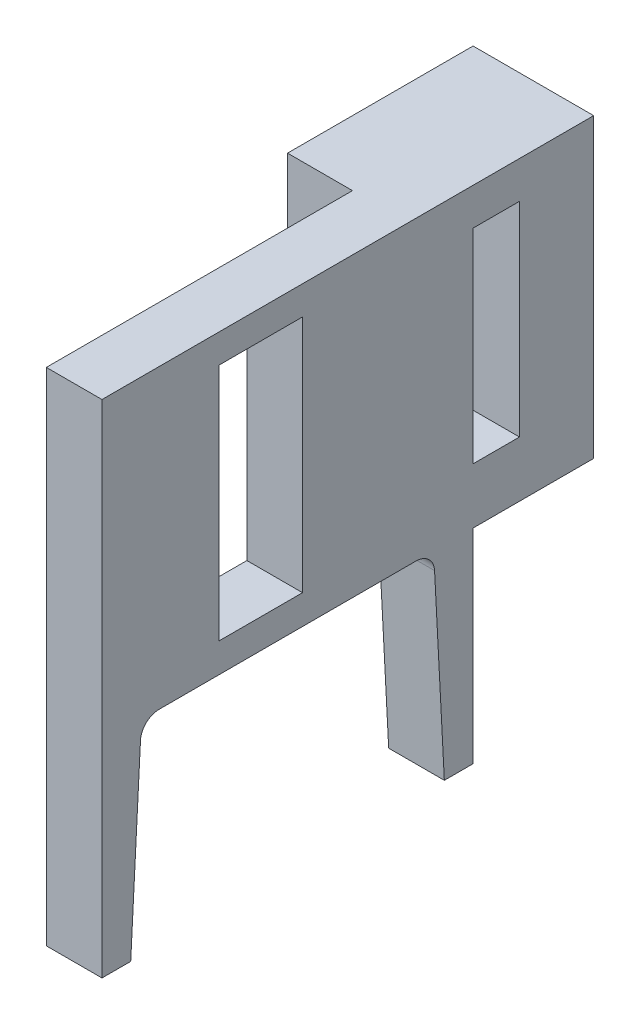
ISO-10303-21;
HEADER;
FILE_DESCRIPTION(('STEP AP214'),'2;1');
FILE_NAME('part.step','',(''),(''),'','','');
FILE_SCHEMA(('AUTOMOTIVE_DESIGN { 1 0 10303 214 1 1 1 1 }'));
ENDSEC;
DATA;
#1=APPLICATION_CONTEXT('core data for automotive mechanical design processes');
#2=APPLICATION_PROTOCOL_DEFINITION('international standard','automotive_design',2000,#1);
#3=PRODUCT_CONTEXT('',#1,'mechanical');
#4=PRODUCT('Part','Part','',(#3));
#5=PRODUCT_RELATED_PRODUCT_CATEGORY('part','',(#4));
#6=PRODUCT_DEFINITION_FORMATION('','',#4);
#7=PRODUCT_DEFINITION_CONTEXT('part definition',#1,'design');
#8=PRODUCT_DEFINITION('design','',#6,#7);
#9=PRODUCT_DEFINITION_SHAPE('','',#8);
#10=(LENGTH_UNIT() NAMED_UNIT(*) SI_UNIT(.MILLI.,.METRE.));
#11=(NAMED_UNIT(*) PLANE_ANGLE_UNIT() SI_UNIT($,.RADIAN.));
#12=(NAMED_UNIT(*) SI_UNIT($,.STERADIAN.) SOLID_ANGLE_UNIT());
#13=UNCERTAINTY_MEASURE_WITH_UNIT(LENGTH_MEASURE(1.E-05),#10,'distance_accuracy_value','');
#14=(GEOMETRIC_REPRESENTATION_CONTEXT(3) GLOBAL_UNCERTAINTY_ASSIGNED_CONTEXT((#13)) GLOBAL_UNIT_ASSIGNED_CONTEXT((#10,
#11,#12)) REPRESENTATION_CONTEXT('',''));
#15=CARTESIAN_POINT('',(0.,0.,0.));
#16=DIRECTION('',(0.,0.,1.));
#17=DIRECTION('',(1.,0.,0.));
#18=AXIS2_PLACEMENT_3D('',#15,#16,#17);
#19=CARTESIAN_POINT('',(13.,-16.,26.5));
#20=DIRECTION('',(0.,1.,0.));
#21=DIRECTION('',(0.,0.,-1.));
#22=AXIS2_PLACEMENT_3D('',#19,#20,#21);
#23=PLANE('',#22);
#24=DIRECTION('',(-1.,0.,0.));
#25=VECTOR('',#24,1.);
#26=CARTESIAN_POINT('',(13.,-16.,26.5));
#27=LINE('',#26,#25);
#28=CARTESIAN_POINT('',(13.,-16.,26.5));
#29=VERTEX_POINT('',#28);
#30=CARTESIAN_POINT('',(7.00000000000001,-16.,26.5));
#31=VERTEX_POINT('',#30);
#32=EDGE_CURVE('E441',#29,#31,#27,.T.);
#33=ORIENTED_EDGE('',*,*,#32,.F.);
#34=DIRECTION('',(0.,0.,1.));
#35=VECTOR('',#34,1.);
#36=CARTESIAN_POINT('',(13.,-16.,26.5));
#37=LINE('',#36,#35);
#38=CARTESIAN_POINT('',(13.,-16.,39.5));
#39=VERTEX_POINT('',#38);
#40=EDGE_CURVE('E438',#29,#39,#37,.T.);
#41=ORIENTED_EDGE('',*,*,#40,.T.);
#42=DIRECTION('',(-1.,0.,0.));
#43=VECTOR('',#42,1.);
#44=CARTESIAN_POINT('',(13.,-16.,39.5));
#45=LINE('',#44,#43);
#46=CARTESIAN_POINT('',(7.00000000000001,-16.,39.5));
#47=VERTEX_POINT('',#46);
#48=EDGE_CURVE('E403',#39,#47,#45,.T.);
#49=ORIENTED_EDGE('',*,*,#48,.T.);
#50=DIRECTION('',(0.,0.,-1.));
#51=VECTOR('',#50,1.);
#52=CARTESIAN_POINT('',(7.00000000000001,-16.,46.5));
#53=LINE('',#52,#51);
#54=EDGE_CURVE('E357',#47,#31,#53,.T.);
#55=ORIENTED_EDGE('',*,*,#54,.T.);
#56=EDGE_LOOP('',(#33,#41,#49,#55));
#57=FACE_BOUND('',#56,.T.);
#58=ADVANCED_FACE('F32',(#57),#23,.F.);
#59=CARTESIAN_POINT('',(0.,0.,53.));
#60=DIRECTION('',(1.,0.,0.));
#61=DIRECTION('',(0.,0.,1.));
#62=AXIS2_PLACEMENT_3D('',#59,#60,#61);
#63=PLANE('',#62);
#64=DIRECTION('',(0.,0.,-1.));
#65=VECTOR('',#64,1.);
#66=CARTESIAN_POINT('',(0.,-10.,39.5));
#67=LINE('',#66,#65);
#68=CARTESIAN_POINT('',(0.,-10.,39.5));
#69=VERTEX_POINT('',#68);
#70=CARTESIAN_POINT('',(0.,-10.,34.5));
#71=VERTEX_POINT('',#70);
#72=EDGE_CURVE('E241',#69,#71,#67,.T.);
#73=ORIENTED_EDGE('',*,*,#72,.T.);
#74=DIRECTION('',(0.,1.,0.));
#75=VECTOR('',#74,1.);
#76=CARTESIAN_POINT('',(0.,12.,34.5));
#77=LINE('',#76,#75);
#78=CARTESIAN_POINT('',(0.,12.,34.5));
#79=VERTEX_POINT('',#78);
#80=EDGE_CURVE('E258',#71,#79,#77,.T.);
#81=ORIENTED_EDGE('',*,*,#80,.T.);
#82=DIRECTION('',(0.,0.,1.));
#83=VECTOR('',#82,1.);
#84=CARTESIAN_POINT('',(0.,12.,39.5));
#85=LINE('',#84,#83);
#86=CARTESIAN_POINT('',(0.,12.,39.5));
#87=VERTEX_POINT('',#86);
#88=EDGE_CURVE('E255',#79,#87,#85,.T.);
#89=ORIENTED_EDGE('',*,*,#88,.T.);
#90=DIRECTION('',(0.,-1.,0.));
#91=VECTOR('',#90,1.);
#92=CARTESIAN_POINT('',(0.,12.,39.5));
#93=LINE('',#92,#91);
#94=EDGE_CURVE('E263',#87,#69,#93,.T.);
#95=ORIENTED_EDGE('',*,*,#94,.T.);
#96=EDGE_LOOP('',(#73,#81,#89,#95));
#97=FACE_BOUND('',#96,.T.);
#98=DIRECTION('',(0.,0.,1.));
#99=VECTOR('',#98,1.);
#100=CARTESIAN_POINT('',(0.,-13.,46.5));
#101=LINE('',#100,#99);
#102=CARTESIAN_POINT('',(0.,-13.,26.5));
#103=VERTEX_POINT('',#102);
#104=CARTESIAN_POINT('',(0.,-13.,46.5));
#105=VERTEX_POINT('',#104);
#106=EDGE_CURVE('E368',#103,#105,#101,.T.);
#107=ORIENTED_EDGE('',*,*,#106,.T.);
#108=DIRECTION('',(0.,1.,0.));
#109=VECTOR('',#108,1.);
#110=CARTESIAN_POINT('',(0.,-16.,46.5));
#111=LINE('',#110,#109);
#112=CARTESIAN_POINT('',(0.,16.,46.5));
#113=VERTEX_POINT('',#112);
#114=EDGE_CURVE('E381',#105,#113,#111,.T.);
#115=ORIENTED_EDGE('',*,*,#114,.T.);
#116=DIRECTION('',(0.,0.,-1.));
#117=VECTOR('',#116,1.);
#118=CARTESIAN_POINT('',(0.,16.,26.5));
#119=LINE('',#118,#117);
#120=CARTESIAN_POINT('',(0.,16.,26.5));
#121=VERTEX_POINT('',#120);
#122=EDGE_CURVE('E428',#113,#121,#119,.T.);
#123=ORIENTED_EDGE('',*,*,#122,.T.);
#124=DIRECTION('',(0.,-1.,0.));
#125=VECTOR('',#124,1.);
#126=CARTESIAN_POINT('',(0.,16.,26.5));
#127=LINE('',#126,#125);
#128=EDGE_CURVE('E433',#121,#103,#127,.T.);
#129=ORIENTED_EDGE('',*,*,#128,.T.);
#130=EDGE_LOOP('',(#107,#115,#123,#129));
#131=FACE_BOUND('',#130,.T.);
#132=ADVANCED_FACE('F537',(#97,#131),#63,.F.);
#133=CARTESIAN_POINT('',(0.,0.,46.5));
#134=DIRECTION('',(0.,0.,-1.));
#135=DIRECTION('',(0.,-1.,0.));
#136=AXIS2_PLACEMENT_3D('',#133,#134,#135);
#137=PLANE('',#136);
#138=DIRECTION('',(1.,0.,0.));
#139=VECTOR('',#138,1.);
#140=CARTESIAN_POINT('',(7.00000000000001,-13.,46.5));
#141=LINE('',#140,#139);
#142=CARTESIAN_POINT('',(7.00000000000001,-13.,46.5));
#143=VERTEX_POINT('',#142);
#144=EDGE_CURVE('E371',#105,#143,#141,.T.);
#145=ORIENTED_EDGE('',*,*,#144,.T.);
#146=DIRECTION('',(0.,-1.,0.));
#147=VECTOR('',#146,1.);
#148=CARTESIAN_POINT('',(7.00000000000001,-16.,46.5));
#149=LINE('',#148,#147);
#150=CARTESIAN_POINT('',(7.00000000000001,16.,46.5));
#151=VERTEX_POINT('',#150);
#152=EDGE_CURVE('E378',#151,#143,#149,.T.);
#153=ORIENTED_EDGE('',*,*,#152,.F.);
#154=DIRECTION('',(1.,0.,0.));
#155=VECTOR('',#154,1.);
#156=CARTESIAN_POINT('',(7.00000000000001,16.,46.5));
#157=LINE('',#156,#155);
#158=EDGE_CURVE('E384',#113,#151,#157,.T.);
#159=ORIENTED_EDGE('',*,*,#158,.F.);
#160=ORIENTED_EDGE('',*,*,#114,.F.);
#161=EDGE_LOOP('',(#145,#153,#159,#160));
#162=FACE_BOUND('',#161,.T.);
#163=ADVANCED_FACE('F541',(#162),#137,.F.);
#164=CARTESIAN_POINT('',(7.,-16.,79.5));
#165=DIRECTION('',(1.,0.,0.));
#166=DIRECTION('',(0.,0.,1.));
#167=AXIS2_PLACEMENT_3D('',#164,#165,#166);
#168=PLANE('',#167);
#169=DIRECTION('',(0.,0.,1.));
#170=VECTOR('',#169,1.);
#171=CARTESIAN_POINT('',(7.,12.9015711105183,68.8814467422432));
#172=LINE('',#171,#170);
#173=CARTESIAN_POINT('',(7.,12.9015711105183,68.8814467422432));
#174=VERTEX_POINT('',#173);
#175=CARTESIAN_POINT('',(7.,12.9015711105183,77.5315578763154));
#176=VERTEX_POINT('',#175);
#177=EDGE_CURVE('E286',#174,#176,#172,.T.);
#178=ORIENTED_EDGE('',*,*,#177,.T.);
#179=DIRECTION('',(0.,-1.,0.));
#180=VECTOR('',#179,1.);
#181=CARTESIAN_POINT('',(7.,12.9015711105183,77.5315578763154));
#182=LINE('',#181,#180);
#183=CARTESIAN_POINT('',(7.,-13.1087867617339,77.5315578763154));
#184=VERTEX_POINT('',#183);
#185=EDGE_CURVE('E289',#176,#184,#182,.T.);
#186=ORIENTED_EDGE('',*,*,#185,.T.);
#187=DIRECTION('',(0.,0.,-1.));
#188=VECTOR('',#187,1.);
#189=CARTESIAN_POINT('',(7.,-13.1087867617339,68.8814467422432));
#190=LINE('',#189,#188);
#191=CARTESIAN_POINT('',(7.,-13.1087867617339,68.8814467422432));
#192=VERTEX_POINT('',#191);
#193=EDGE_CURVE('E277',#184,#192,#190,.T.);
#194=ORIENTED_EDGE('',*,*,#193,.T.);
#195=DIRECTION('',(0.,1.,0.));
#196=VECTOR('',#195,1.);
#197=CARTESIAN_POINT('',(7.,12.9015711105183,68.8814467422432));
#198=LINE('',#197,#196);
#199=EDGE_CURVE('E269',#192,#174,#198,.T.);
#200=ORIENTED_EDGE('',*,*,#199,.T.);
#201=EDGE_LOOP('',(#178,#186,#194,#200));
#202=FACE_BOUND('',#201,.T.);
#203=DIRECTION('',(0.,0.,-1.));
#204=VECTOR('',#203,1.);
#205=CARTESIAN_POINT('',(7.,-13.,56.6189440090903));
#206=LINE('',#205,#204);
#207=CARTESIAN_POINT('',(7.,-13.,56.6189440090903));
#208=VERTEX_POINT('',#207);
#209=CARTESIAN_POINT('',(7.,-13.,48.1070713689883));
#210=VERTEX_POINT('',#209);
#211=EDGE_CURVE('E315',#208,#210,#206,.T.);
#212=ORIENTED_EDGE('',*,*,#211,.T.);
#213=DIRECTION('',(0.,1.,0.));
#214=VECTOR('',#213,1.);
#215=CARTESIAN_POINT('',(7.,12.6981992928279,48.1070713689883));
#216=LINE('',#215,#214);
#217=CARTESIAN_POINT('',(7.,12.6981992928279,48.1070713689883));
#218=VERTEX_POINT('',#217);
#219=EDGE_CURVE('E318',#210,#218,#216,.T.);
#220=ORIENTED_EDGE('',*,*,#219,.T.);
#221=DIRECTION('',(0.,0.,1.));
#222=VECTOR('',#221,1.);
#223=CARTESIAN_POINT('',(7.,12.6981992928279,56.6189440090903));
#224=LINE('',#223,#222);
#225=CARTESIAN_POINT('',(7.,12.6981992928279,56.6189440090903));
#226=VERTEX_POINT('',#225);
#227=EDGE_CURVE('E306',#218,#226,#224,.T.);
#228=ORIENTED_EDGE('',*,*,#227,.T.);
#229=DIRECTION('',(0.,-1.,0.));
#230=VECTOR('',#229,1.);
#231=CARTESIAN_POINT('',(7.,12.6981992928279,56.6189440090903));
#232=LINE('',#231,#230);
#233=EDGE_CURVE('E296',#226,#208,#232,.T.);
#234=ORIENTED_EDGE('',*,*,#233,.T.);
#235=EDGE_LOOP('',(#212,#220,#228,#234));
#236=FACE_BOUND('',#235,.T.);
#237=DIRECTION('',(0.,0.,-1.));
#238=VECTOR('',#237,1.);
#239=CARTESIAN_POINT('',(7.,-12.8405154349878,66.8814467422432));
#240=LINE('',#239,#238);
#241=CARTESIAN_POINT('',(7.,-12.8405154349878,66.8814467422432));
#242=VERTEX_POINT('',#241);
#243=CARTESIAN_POINT('',(7.,-12.8405154349878,57.8814467422432));
#244=VERTEX_POINT('',#243);
#245=EDGE_CURVE('E347',#242,#244,#240,.T.);
#246=ORIENTED_EDGE('',*,*,#245,.T.);
#247=DIRECTION('',(0.,1.,0.));
#248=VECTOR('',#247,1.);
#249=CARTESIAN_POINT('',(7.,12.9015711105183,57.8814467422432));
#250=LINE('',#249,#248);
#251=CARTESIAN_POINT('',(7.,12.9015711105183,57.8814467422432));
#252=VERTEX_POINT('',#251);
#253=EDGE_CURVE('E350',#244,#252,#250,.T.);
#254=ORIENTED_EDGE('',*,*,#253,.T.);
#255=DIRECTION('',(0.,0.,1.));
#256=VECTOR('',#255,1.);
#257=CARTESIAN_POINT('',(7.,12.9015711105183,66.8814467422432));
#258=LINE('',#257,#256);
#259=CARTESIAN_POINT('',(7.,12.9015711105183,66.8814467422432));
#260=VERTEX_POINT('',#259);
#261=EDGE_CURVE('E335',#252,#260,#258,.T.);
#262=ORIENTED_EDGE('',*,*,#261,.T.);
#263=DIRECTION('',(0.,-1.,0.));
#264=VECTOR('',#263,1.);
#265=CARTESIAN_POINT('',(7.,12.9015711105183,66.8814467422432));
#266=LINE('',#265,#264);
#267=EDGE_CURVE('E325',#260,#242,#266,.T.);
#268=ORIENTED_EDGE('',*,*,#267,.T.);
#269=EDGE_LOOP('',(#246,#254,#262,#268));
#270=FACE_BOUND('',#269,.T.);
#271=ORIENTED_EDGE('',*,*,#152,.T.);
#272=DIRECTION('',(0.,0.,-1.));
#273=VECTOR('',#272,1.);
#274=CARTESIAN_POINT('',(7.00000000000001,-13.,46.5));
#275=LINE('',#274,#273);
#276=CARTESIAN_POINT('',(7.00000000000001,-13.,26.5));
#277=VERTEX_POINT('',#276);
#278=EDGE_CURVE('E363',#143,#277,#275,.T.);
#279=ORIENTED_EDGE('',*,*,#278,.T.);
#280=DIRECTION('',(0.,-1.,0.));
#281=VECTOR('',#280,1.);
#282=CARTESIAN_POINT('',(7.00000000000001,-13.,26.5));
#283=LINE('',#282,#281);
#284=EDGE_CURVE('E374',#277,#31,#283,.T.);
#285=ORIENTED_EDGE('',*,*,#284,.T.);
#286=ORIENTED_EDGE('',*,*,#54,.F.);
#287=DIRECTION('',(0.,1.,0.));
#288=VECTOR('',#287,1.);
#289=CARTESIAN_POINT('',(7.00000000000001,-38.,39.5));
#290=LINE('',#289,#288);
#291=CARTESIAN_POINT('',(7.00000000000001,-38.,39.5));
#292=VERTEX_POINT('',#291);
#293=EDGE_CURVE('E416',#292,#47,#290,.T.);
#294=ORIENTED_EDGE('',*,*,#293,.F.);
#295=DIRECTION('',(0.,0.,1.));
#296=VECTOR('',#295,1.);
#297=CARTESIAN_POINT('',(7.,-38.,79.5));
#298=LINE('',#297,#296);
#299=CARTESIAN_POINT('',(7.,-38.,42.5970288557731));
#300=VERTEX_POINT('',#299);
#301=EDGE_CURVE('E411',#292,#300,#298,.T.);
#302=ORIENTED_EDGE('',*,*,#301,.T.);
#303=DIRECTION('',(0.,-0.998629534754574,-0.0523359562429442));
#304=VECTOR('',#303,1.);
#305=CARTESIAN_POINT('',(7.,-14.1315537190907,43.8479211202921));
#306=LINE('',#305,#304);
#307=CARTESIAN_POINT('',(7.,-17.8953280875141,43.6506700639206));
#308=VERTEX_POINT('',#307);
#309=EDGE_CURVE('E398',#300,#308,#306,.F.);
#310=ORIENTED_EDGE('',*,*,#309,.T.);
#311=CARTESIAN_POINT('',(7.,-18.,45.6479291334297));
#312=DIRECTION('',(-1.,0.,0.));
#313=DIRECTION('',(0.,0.,1.));
#314=AXIS2_PLACEMENT_3D('',#311,#312,#313);
#315=CIRCLE('',#314,2.);
#316=CARTESIAN_POINT('',(7.00000000000001,-16.,45.6479291334297));
#317=VERTEX_POINT('',#316);
#318=EDGE_CURVE('E11',#308,#317,#315,.F.);
#319=ORIENTED_EDGE('',*,*,#318,.T.);
#320=DIRECTION('',(0.,0.,1.));
#321=VECTOR('',#320,1.);
#322=CARTESIAN_POINT('',(7.00000000000001,-16.,43.75));
#323=LINE('',#322,#321);
#324=CARTESIAN_POINT('',(7.00000000000001,-16.,73.3520708665702));
#325=VERTEX_POINT('',#324);
#326=EDGE_CURVE('E389',#317,#325,#323,.T.);
#327=ORIENTED_EDGE('',*,*,#326,.T.);
#328=CARTESIAN_POINT('',(7.,-18.,73.3520708665702));
#329=DIRECTION('',(-1.,0.,0.));
#330=DIRECTION('',(0.,0.,1.));
#331=AXIS2_PLACEMENT_3D('',#328,#329,#330);
#332=CIRCLE('',#331,2.);
#333=CARTESIAN_POINT('',(7.,-17.8953280875141,75.3493299360794));
#334=VERTEX_POINT('',#333);
#335=EDGE_CURVE('E464',#325,#334,#332,.F.);
#336=ORIENTED_EDGE('',*,*,#335,.T.);
#337=DIRECTION('',(0.,0.998629534754574,-0.0523359562429437));
#338=VECTOR('',#337,1.);
#339=CARTESIAN_POINT('',(7.,-16.2221229844438,75.2616409723424));
#340=LINE('',#339,#338);
#341=CARTESIAN_POINT('',(7.,-38.,76.4029711442269));
#342=VERTEX_POINT('',#341);
#343=EDGE_CURVE('E392',#334,#342,#340,.F.);
#344=ORIENTED_EDGE('',*,*,#343,.T.);
#345=CARTESIAN_POINT('',(7.,-38.,79.5));
#346=VERTEX_POINT('',#345);
#347=EDGE_CURVE('E410',#342,#346,#298,.T.);
#348=ORIENTED_EDGE('',*,*,#347,.T.);
#349=DIRECTION('',(0.,1.,0.));
#350=VECTOR('',#349,1.);
#351=CARTESIAN_POINT('',(7.,-16.,79.5));
#352=LINE('',#351,#350);
#353=CARTESIAN_POINT('',(7.,16.,79.5));
#354=VERTEX_POINT('',#353);
#355=EDGE_CURVE('E425',#346,#354,#352,.T.);
#356=ORIENTED_EDGE('',*,*,#355,.T.);
#357=DIRECTION('',(0.,0.,1.));
#358=VECTOR('',#357,1.);
#359=CARTESIAN_POINT('',(7.,16.,79.5));
#360=LINE('',#359,#358);
#361=EDGE_CURVE('E422',#151,#354,#360,.T.);
#362=ORIENTED_EDGE('',*,*,#361,.F.);
#363=EDGE_LOOP('',(#271,#279,#285,#286,#294,#302,#310,#319,#327,#336,#344,#348,#356,#362));
#364=FACE_BOUND('',#363,.T.);
#365=ADVANCED_FACE('F522',(#202,#236,#270,#364),#168,.F.);
#366=CARTESIAN_POINT('',(0.,-18.,45.6479291334297));
#367=DIRECTION('',(1.,0.,0.));
#368=DIRECTION('',(0.,0.,1.));
#369=AXIS2_PLACEMENT_3D('',#366,#367,#368);
#370=CYLINDRICAL_SURFACE('',#369,2.);
#371=DIRECTION('',(1.,0.,0.));
#372=VECTOR('',#371,1.);
#373=CARTESIAN_POINT('',(0.,-16.,45.6479291334297));
#374=LINE('',#373,#372);
#375=CARTESIAN_POINT('',(13.,-16.,45.6479291334297));
#376=VERTEX_POINT('',#375);
#377=EDGE_CURVE('E467',#376,#317,#374,.F.);
#378=ORIENTED_EDGE('',*,*,#377,.T.);
#379=ORIENTED_EDGE('',*,*,#318,.F.);
#380=DIRECTION('',(-1.,0.,0.));
#381=VECTOR('',#380,1.);
#382=CARTESIAN_POINT('',(13.,-17.8953280875141,43.6506700639206));
#383=LINE('',#382,#381);
#384=CARTESIAN_POINT('',(13.,-17.8953280875141,43.6506700639206));
#385=VERTEX_POINT('',#384);
#386=EDGE_CURVE('E469',#308,#385,#383,.F.);
#387=ORIENTED_EDGE('',*,*,#386,.T.);
#388=CARTESIAN_POINT('',(13.,-18.,45.6479291334297));
#389=DIRECTION('',(-1.,0.,0.));
#390=DIRECTION('',(0.,0.,1.));
#391=AXIS2_PLACEMENT_3D('',#388,#389,#390);
#392=CIRCLE('',#391,2.);
#393=EDGE_CURVE('E40',#376,#385,#392,.T.);
#394=ORIENTED_EDGE('',*,*,#393,.F.);
#395=EDGE_LOOP('',(#378,#379,#387,#394));
#396=FACE_BOUND('',#395,.T.);
#397=ADVANCED_FACE('F34',(#396),#370,.F.);
#398=CARTESIAN_POINT('',(13.,-18.,73.3520708665702));
#399=DIRECTION('',(1.,0.,0.));
#400=DIRECTION('',(0.,0.,1.));
#401=AXIS2_PLACEMENT_3D('',#398,#399,#400);
#402=CYLINDRICAL_SURFACE('',#401,2.);
#403=DIRECTION('',(-1.,0.,0.));
#404=VECTOR('',#403,1.);
#405=CARTESIAN_POINT('',(13.,-17.8953280875141,75.3493299360794));
#406=LINE('',#405,#404);
#407=CARTESIAN_POINT('',(13.,-17.8953280875141,75.3493299360794));
#408=VERTEX_POINT('',#407);
#409=EDGE_CURVE('E456',#408,#334,#406,.T.);
#410=ORIENTED_EDGE('',*,*,#409,.T.);
#411=ORIENTED_EDGE('',*,*,#335,.F.);
#412=DIRECTION('',(1.,0.,0.));
#413=VECTOR('',#412,1.);
#414=CARTESIAN_POINT('',(0.,-16.,73.3520708665702));
#415=LINE('',#414,#413);
#416=CARTESIAN_POINT('',(13.,-16.,73.3520708665702));
#417=VERTEX_POINT('',#416);
#418=EDGE_CURVE('E458',#325,#417,#415,.T.);
#419=ORIENTED_EDGE('',*,*,#418,.T.);
#420=CARTESIAN_POINT('',(13.,-18.,73.3520708665702));
#421=DIRECTION('',(-1.,0.,0.));
#422=DIRECTION('',(0.,0.,1.));
#423=AXIS2_PLACEMENT_3D('',#420,#421,#422);
#424=CIRCLE('',#423,2.);
#425=EDGE_CURVE('E461',#408,#417,#424,.T.);
#426=ORIENTED_EDGE('',*,*,#425,.F.);
#427=EDGE_LOOP('',(#410,#411,#419,#426));
#428=FACE_BOUND('',#427,.T.);
#429=ADVANCED_FACE('F517',(#428),#402,.F.);
#430=CARTESIAN_POINT('',(13.,0.,53.));
#431=DIRECTION('',(1.,0.,0.));
#432=DIRECTION('',(0.,0.,1.));
#433=AXIS2_PLACEMENT_3D('',#430,#431,#432);
#434=PLANE('',#433);
#435=DIRECTION('',(0.,-1.,0.));
#436=VECTOR('',#435,1.);
#437=CARTESIAN_POINT('',(13.,12.,39.5));
#438=LINE('',#437,#436);
#439=CARTESIAN_POINT('',(13.,12.,39.5));
#440=VERTEX_POINT('',#439);
#441=CARTESIAN_POINT('',(13.,-10.,39.5));
#442=VERTEX_POINT('',#441);
#443=EDGE_CURVE('E249',#440,#442,#438,.T.);
#444=ORIENTED_EDGE('',*,*,#443,.F.);
#445=DIRECTION('',(0.,0.,1.));
#446=VECTOR('',#445,1.);
#447=CARTESIAN_POINT('',(13.,12.,39.5));
#448=LINE('',#447,#446);
#449=CARTESIAN_POINT('',(13.,12.,34.5));
#450=VERTEX_POINT('',#449);
#451=EDGE_CURVE('E242',#450,#440,#448,.T.);
#452=ORIENTED_EDGE('',*,*,#451,.F.);
#453=DIRECTION('',(0.,1.,0.));
#454=VECTOR('',#453,1.);
#455=CARTESIAN_POINT('',(13.,12.,34.5));
#456=LINE('',#455,#454);
#457=CARTESIAN_POINT('',(13.,-10.,34.5));
#458=VERTEX_POINT('',#457);
#459=EDGE_CURVE('E250',#458,#450,#456,.T.);
#460=ORIENTED_EDGE('',*,*,#459,.F.);
#461=DIRECTION('',(0.,0.,-1.));
#462=VECTOR('',#461,1.);
#463=CARTESIAN_POINT('',(13.,-10.,39.5));
#464=LINE('',#463,#462);
#465=EDGE_CURVE('E238',#442,#458,#464,.T.);
#466=ORIENTED_EDGE('',*,*,#465,.F.);
#467=EDGE_LOOP('',(#444,#452,#460,#466));
#468=FACE_BOUND('',#467,.T.);
#469=DIRECTION('',(0.,-1.,0.));
#470=VECTOR('',#469,1.);
#471=CARTESIAN_POINT('',(13.,12.9015711105183,66.8814467422432));
#472=LINE('',#471,#470);
#473=CARTESIAN_POINT('',(13.,12.9015711105183,66.8814467422432));
#474=VERTEX_POINT('',#473);
#475=CARTESIAN_POINT('',(13.,-12.8405154349878,66.8814467422432));
#476=VERTEX_POINT('',#475);
#477=EDGE_CURVE('E331',#474,#476,#472,.T.);
#478=ORIENTED_EDGE('',*,*,#477,.F.);
#479=DIRECTION('',(0.,0.,1.));
#480=VECTOR('',#479,1.);
#481=CARTESIAN_POINT('',(13.,12.9015711105183,66.8814467422432));
#482=LINE('',#481,#480);
#483=CARTESIAN_POINT('',(13.,12.9015711105183,57.8814467422432));
#484=VERTEX_POINT('',#483);
#485=EDGE_CURVE('E341',#484,#474,#482,.T.);
#486=ORIENTED_EDGE('',*,*,#485,.F.);
#487=DIRECTION('',(0.,1.,0.));
#488=VECTOR('',#487,1.);
#489=CARTESIAN_POINT('',(13.,12.9015711105183,57.8814467422432));
#490=LINE('',#489,#488);
#491=CARTESIAN_POINT('',(13.,-12.8405154349878,57.8814467422432));
#492=VERTEX_POINT('',#491);
#493=EDGE_CURVE('E338',#492,#484,#490,.T.);
#494=ORIENTED_EDGE('',*,*,#493,.F.);
#495=DIRECTION('',(0.,0.,-1.));
#496=VECTOR('',#495,1.);
#497=CARTESIAN_POINT('',(13.,-12.8405154349878,66.8814467422432));
#498=LINE('',#497,#496);
#499=EDGE_CURVE('E334',#476,#492,#498,.T.);
#500=ORIENTED_EDGE('',*,*,#499,.F.);
#501=EDGE_LOOP('',(#478,#486,#494,#500));
#502=FACE_BOUND('',#501,.T.);
#503=ORIENTED_EDGE('',*,*,#425,.T.);
#504=DIRECTION('',(0.,0.,-1.));
#505=VECTOR('',#504,1.);
#506=CARTESIAN_POINT('',(13.,-16.,43.75));
#507=LINE('',#506,#505);
#508=EDGE_CURVE('E387',#417,#376,#507,.T.);
#509=ORIENTED_EDGE('',*,*,#508,.T.);
#510=ORIENTED_EDGE('',*,*,#393,.T.);
#511=DIRECTION('',(0.,-0.998629534754574,-0.0523359562429442));
#512=VECTOR('',#511,1.);
#513=CARTESIAN_POINT('',(13.,0.439619305559081,44.611563940063));
#514=LINE('',#513,#512);
#515=CARTESIAN_POINT('',(13.,-38.,42.5970288557731));
#516=VERTEX_POINT('',#515);
#517=EDGE_CURVE('E401',#516,#385,#514,.F.);
#518=ORIENTED_EDGE('',*,*,#517,.F.);
#519=DIRECTION('',(0.,0.,-1.));
#520=VECTOR('',#519,1.);
#521=CARTESIAN_POINT('',(13.,-38.,79.5));
#522=LINE('',#521,#520);
#523=CARTESIAN_POINT('',(13.,-38.,39.5));
#524=VERTEX_POINT('',#523);
#525=EDGE_CURVE('E408',#516,#524,#522,.T.);
#526=ORIENTED_EDGE('',*,*,#525,.T.);
#527=DIRECTION('',(0.,1.,0.));
#528=VECTOR('',#527,1.);
#529=CARTESIAN_POINT('',(13.,-38.,39.5));
#530=LINE('',#529,#528);
#531=EDGE_CURVE('E420',#524,#39,#530,.T.);
#532=ORIENTED_EDGE('',*,*,#531,.T.);
#533=ORIENTED_EDGE('',*,*,#40,.F.);
#534=DIRECTION('',(0.,-1.,0.));
#535=VECTOR('',#534,1.);
#536=CARTESIAN_POINT('',(13.,16.,26.5));
#537=LINE('',#536,#535);
#538=CARTESIAN_POINT('',(13.,16.,26.5));
#539=VERTEX_POINT('',#538);
#540=EDGE_CURVE('E436',#539,#29,#537,.T.);
#541=ORIENTED_EDGE('',*,*,#540,.F.);
#542=DIRECTION('',(0.,0.,-1.));
#543=VECTOR('',#542,1.);
#544=CARTESIAN_POINT('',(13.,16.,26.5));
#545=LINE('',#544,#543);
#546=CARTESIAN_POINT('',(13.,16.,79.5));
#547=VERTEX_POINT('',#546);
#548=EDGE_CURVE('E432',#547,#539,#545,.T.);
#549=ORIENTED_EDGE('',*,*,#548,.F.);
#550=DIRECTION('',(0.,1.,0.));
#551=VECTOR('',#550,1.);
#552=CARTESIAN_POINT('',(13.,16.,79.5));
#553=LINE('',#552,#551);
#554=CARTESIAN_POINT('',(13.,-38.,79.5));
#555=VERTEX_POINT('',#554);
#556=EDGE_CURVE('E429',#555,#547,#553,.T.);
#557=ORIENTED_EDGE('',*,*,#556,.F.);
#558=CARTESIAN_POINT('',(13.,-38.,76.4029711442269));
#559=VERTEX_POINT('',#558);
#560=EDGE_CURVE('E404',#555,#559,#522,.T.);
#561=ORIENTED_EDGE('',*,*,#560,.T.);
#562=DIRECTION('',(0.,0.998629534754574,-0.0523359562429437));
#563=VECTOR('',#562,1.);
#564=CARTESIAN_POINT('',(13.,1.11905431679882,74.3528283798308));
#565=LINE('',#564,#563);
#566=EDGE_CURVE('E395',#408,#559,#565,.F.);
#567=ORIENTED_EDGE('',*,*,#566,.F.);
#568=EDGE_LOOP('',(#503,#509,#510,#518,#526,#532,#533,#541,#549,#557,#561,#567));
#569=FACE_BOUND('',#568,.T.);
#570=ADVANCED_FACE('F246',(#468,#502,#569),#434,.T.);
#571=CARTESIAN_POINT('',(0.,-38.,53.));
#572=DIRECTION('',(0.,-1.,0.));
#573=DIRECTION('',(0.,0.,1.));
#574=AXIS2_PLACEMENT_3D('',#571,#572,#573);
#575=PLANE('',#574);
#576=ORIENTED_EDGE('',*,*,#301,.F.);
#577=DIRECTION('',(-1.,0.,0.));
#578=VECTOR('',#577,1.);
#579=CARTESIAN_POINT('',(13.,-38.,39.5));
#580=LINE('',#579,#578);
#581=EDGE_CURVE('E407',#524,#292,#580,.T.);
#582=ORIENTED_EDGE('',*,*,#581,.F.);
#583=ORIENTED_EDGE('',*,*,#525,.F.);
#584=DIRECTION('',(-1.,0.,0.));
#585=VECTOR('',#584,1.);
#586=CARTESIAN_POINT('',(0.,-38.,42.5970288557731));
#587=LINE('',#586,#585);
#588=EDGE_CURVE('E454',#300,#516,#587,.F.);
#589=ORIENTED_EDGE('',*,*,#588,.F.);
#590=EDGE_LOOP('',(#576,#582,#583,#589));
#591=FACE_BOUND('',#590,.T.);
#592=ADVANCED_FACE('F485',(#591),#575,.T.);
#593=ORIENTED_EDGE('',*,*,#560,.F.);
#594=DIRECTION('',(1.,0.,0.));
#595=VECTOR('',#594,1.);
#596=CARTESIAN_POINT('',(13.,-38.,79.5));
#597=LINE('',#596,#595);
#598=EDGE_CURVE('E414',#346,#555,#597,.T.);
#599=ORIENTED_EDGE('',*,*,#598,.F.);
#600=ORIENTED_EDGE('',*,*,#347,.F.);
#601=DIRECTION('',(1.,0.,0.));
#602=VECTOR('',#601,1.);
#603=CARTESIAN_POINT('',(0.,-38.,76.4029711442269));
#604=LINE('',#603,#602);
#605=EDGE_CURVE('E452',#559,#342,#604,.F.);
#606=ORIENTED_EDGE('',*,*,#605,.F.);
#607=EDGE_LOOP('',(#593,#599,#600,#606));
#608=FACE_BOUND('',#607,.T.);
#609=ADVANCED_FACE('F512',(#608),#575,.T.);
#610=ORIENTED_EDGE('',*,*,#377,.F.);
#611=ORIENTED_EDGE('',*,*,#508,.F.);
#612=ORIENTED_EDGE('',*,*,#418,.F.);
#613=ORIENTED_EDGE('',*,*,#326,.F.);
#614=EDGE_LOOP('',(#610,#611,#612,#613));
#615=FACE_BOUND('',#614,.T.);
#616=ADVANCED_FACE('F525',(#615),#23,.F.);
#617=CARTESIAN_POINT('',(13.,16.,79.5));
#618=DIRECTION('',(0.,0.,-1.));
#619=DIRECTION('',(1.,0.,0.));
#620=AXIS2_PLACEMENT_3D('',#617,#618,#619);
#621=PLANE('',#620);
#622=ORIENTED_EDGE('',*,*,#556,.T.);
#623=DIRECTION('',(-1.,0.,0.));
#624=VECTOR('',#623,1.);
#625=CARTESIAN_POINT('',(13.,16.,79.5));
#626=LINE('',#625,#624);
#627=EDGE_CURVE('E450',#547,#354,#626,.T.);
#628=ORIENTED_EDGE('',*,*,#627,.T.);
#629=ORIENTED_EDGE('',*,*,#355,.F.);
#630=ORIENTED_EDGE('',*,*,#598,.T.);
#631=EDGE_LOOP('',(#622,#628,#629,#630));
#632=FACE_BOUND('',#631,.T.);
#633=ADVANCED_FACE('F507',(#632),#621,.F.);
#634=CARTESIAN_POINT('',(13.,16.,26.5));
#635=DIRECTION('',(0.,-1.,0.));
#636=DIRECTION('',(0.,0.,1.));
#637=AXIS2_PLACEMENT_3D('',#634,#635,#636);
#638=PLANE('',#637);
#639=ORIENTED_EDGE('',*,*,#361,.T.);
#640=ORIENTED_EDGE('',*,*,#627,.F.);
#641=ORIENTED_EDGE('',*,*,#548,.T.);
#642=DIRECTION('',(-1.,0.,0.));
#643=VECTOR('',#642,1.);
#644=CARTESIAN_POINT('',(13.,16.,26.5));
#645=LINE('',#644,#643);
#646=EDGE_CURVE('E448',#539,#121,#645,.T.);
#647=ORIENTED_EDGE('',*,*,#646,.T.);
#648=ORIENTED_EDGE('',*,*,#122,.F.);
#649=ORIENTED_EDGE('',*,*,#158,.T.);
#650=EDGE_LOOP('',(#639,#640,#641,#647,#648,#649));
#651=FACE_BOUND('',#650,.T.);
#652=ADVANCED_FACE('F503',(#651),#638,.F.);
#653=CARTESIAN_POINT('',(13.,16.,26.5));
#654=DIRECTION('',(0.,0.,1.));
#655=DIRECTION('',(0.,1.,0.));
#656=AXIS2_PLACEMENT_3D('',#653,#654,#655);
#657=PLANE('',#656);
#658=DIRECTION('',(-1.,0.,0.));
#659=VECTOR('',#658,1.);
#660=CARTESIAN_POINT('',(7.00000000000001,-13.,26.5));
#661=LINE('',#660,#659);
#662=EDGE_CURVE('E366',#277,#103,#661,.T.);
#663=ORIENTED_EDGE('',*,*,#662,.T.);
#664=ORIENTED_EDGE('',*,*,#128,.F.);
#665=ORIENTED_EDGE('',*,*,#646,.F.);
#666=ORIENTED_EDGE('',*,*,#540,.T.);
#667=ORIENTED_EDGE('',*,*,#32,.T.);
#668=ORIENTED_EDGE('',*,*,#284,.F.);
#669=EDGE_LOOP('',(#663,#664,#665,#666,#667,#668));
#670=FACE_BOUND('',#669,.T.);
#671=ADVANCED_FACE('F498',(#670),#657,.F.);
#672=CARTESIAN_POINT('',(13.,-38.,39.5));
#673=DIRECTION('',(0.,0.,1.));
#674=DIRECTION('',(-1.,0.,0.));
#675=AXIS2_PLACEMENT_3D('',#672,#673,#674);
#676=PLANE('',#675);
#677=ORIENTED_EDGE('',*,*,#48,.F.);
#678=ORIENTED_EDGE('',*,*,#531,.F.);
#679=ORIENTED_EDGE('',*,*,#581,.T.);
#680=ORIENTED_EDGE('',*,*,#293,.T.);
#681=EDGE_LOOP('',(#677,#678,#679,#680));
#682=FACE_BOUND('',#681,.T.);
#683=ADVANCED_FACE('F492',(#682),#676,.F.);
#684=CARTESIAN_POINT('',(13.,-16.,43.75));
#685=DIRECTION('',(0.,0.0523359562429442,-0.998629534754574));
#686=DIRECTION('',(0.,-0.998629534754574,-0.0523359562429442));
#687=AXIS2_PLACEMENT_3D('',#684,#685,#686);
#688=PLANE('',#687);
#689=ORIENTED_EDGE('',*,*,#309,.F.);
#690=ORIENTED_EDGE('',*,*,#588,.T.);
#691=ORIENTED_EDGE('',*,*,#517,.T.);
#692=ORIENTED_EDGE('',*,*,#386,.F.);
#693=EDGE_LOOP('',(#689,#690,#691,#692));
#694=FACE_BOUND('',#693,.T.);
#695=ADVANCED_FACE('F481',(#694),#688,.F.);
#696=CARTESIAN_POINT('',(13.,-16.,75.25));
#697=DIRECTION('',(0.,0.0523359562429437,0.998629534754574));
#698=DIRECTION('',(0.,0.998629534754574,-0.0523359562429437));
#699=AXIS2_PLACEMENT_3D('',#696,#697,#698);
#700=PLANE('',#699);
#701=ORIENTED_EDGE('',*,*,#566,.T.);
#702=ORIENTED_EDGE('',*,*,#605,.T.);
#703=ORIENTED_EDGE('',*,*,#343,.F.);
#704=ORIENTED_EDGE('',*,*,#409,.F.);
#705=EDGE_LOOP('',(#701,#702,#703,#704));
#706=FACE_BOUND('',#705,.T.);
#707=ADVANCED_FACE('F520',(#706),#700,.F.);
#708=CARTESIAN_POINT('',(0.,-13.,53.));
#709=DIRECTION('',(0.,-1.,0.));
#710=DIRECTION('',(0.,0.,1.));
#711=AXIS2_PLACEMENT_3D('',#708,#709,#710);
#712=PLANE('',#711);
#713=ORIENTED_EDGE('',*,*,#278,.F.);
#714=ORIENTED_EDGE('',*,*,#144,.F.);
#715=ORIENTED_EDGE('',*,*,#106,.F.);
#716=ORIENTED_EDGE('',*,*,#662,.F.);
#717=EDGE_LOOP('',(#713,#714,#715,#716));
#718=FACE_BOUND('',#717,.T.);
#719=ADVANCED_FACE('F561',(#718),#712,.T.);
#720=CARTESIAN_POINT('',(13.,12.9015711105183,66.8814467422432));
#721=DIRECTION('',(0.,0.,1.));
#722=DIRECTION('',(-1.,0.,0.));
#723=AXIS2_PLACEMENT_3D('',#720,#721,#722);
#724=PLANE('',#723);
#725=ORIENTED_EDGE('',*,*,#267,.F.);
#726=DIRECTION('',(-1.,0.,0.));
#727=VECTOR('',#726,1.);
#728=CARTESIAN_POINT('',(13.,12.9015711105183,66.8814467422432));
#729=LINE('',#728,#727);
#730=EDGE_CURVE('E355',#474,#260,#729,.T.);
#731=ORIENTED_EDGE('',*,*,#730,.F.);
#732=ORIENTED_EDGE('',*,*,#477,.T.);
#733=DIRECTION('',(-1.,0.,0.));
#734=VECTOR('',#733,1.);
#735=CARTESIAN_POINT('',(13.,-12.8405154349878,66.8814467422432));
#736=LINE('',#735,#734);
#737=EDGE_CURVE('E344',#476,#242,#736,.T.);
#738=ORIENTED_EDGE('',*,*,#737,.T.);
#739=EDGE_LOOP('',(#725,#731,#732,#738));
#740=FACE_BOUND('',#739,.T.);
#741=ADVANCED_FACE('F565',(#740),#724,.F.);
#742=CARTESIAN_POINT('',(13.,12.9015711105183,66.8814467422432));
#743=DIRECTION('',(0.,1.,0.));
#744=DIRECTION('',(-1.,0.,0.));
#745=AXIS2_PLACEMENT_3D('',#742,#743,#744);
#746=PLANE('',#745);
#747=ORIENTED_EDGE('',*,*,#261,.F.);
#748=DIRECTION('',(-1.,0.,0.));
#749=VECTOR('',#748,1.);
#750=CARTESIAN_POINT('',(13.,12.9015711105183,57.8814467422432));
#751=LINE('',#750,#749);
#752=EDGE_CURVE('E358',#484,#252,#751,.T.);
#753=ORIENTED_EDGE('',*,*,#752,.F.);
#754=ORIENTED_EDGE('',*,*,#485,.T.);
#755=ORIENTED_EDGE('',*,*,#730,.T.);
#756=EDGE_LOOP('',(#747,#753,#754,#755));
#757=FACE_BOUND('',#756,.T.);
#758=ADVANCED_FACE('F569',(#757),#746,.F.);
#759=CARTESIAN_POINT('',(13.,12.9015711105183,57.8814467422432));
#760=DIRECTION('',(0.,0.,-1.));
#761=DIRECTION('',(1.,0.,0.));
#762=AXIS2_PLACEMENT_3D('',#759,#760,#761);
#763=PLANE('',#762);
#764=ORIENTED_EDGE('',*,*,#253,.F.);
#765=DIRECTION('',(-1.,0.,0.));
#766=VECTOR('',#765,1.);
#767=CARTESIAN_POINT('',(13.,-12.8405154349878,57.8814467422432));
#768=LINE('',#767,#766);
#769=EDGE_CURVE('E360',#492,#244,#768,.T.);
#770=ORIENTED_EDGE('',*,*,#769,.F.);
#771=ORIENTED_EDGE('',*,*,#493,.T.);
#772=ORIENTED_EDGE('',*,*,#752,.T.);
#773=EDGE_LOOP('',(#764,#770,#771,#772));
#774=FACE_BOUND('',#773,.T.);
#775=ADVANCED_FACE('F575',(#774),#763,.F.);
#776=CARTESIAN_POINT('',(13.,-12.8405154349878,66.8814467422432));
#777=DIRECTION('',(0.,-1.,0.));
#778=DIRECTION('',(1.,0.,0.));
#779=AXIS2_PLACEMENT_3D('',#776,#777,#778);
#780=PLANE('',#779);
#781=ORIENTED_EDGE('',*,*,#245,.F.);
#782=ORIENTED_EDGE('',*,*,#737,.F.);
#783=ORIENTED_EDGE('',*,*,#499,.T.);
#784=ORIENTED_EDGE('',*,*,#769,.T.);
#785=EDGE_LOOP('',(#781,#782,#783,#784));
#786=FACE_BOUND('',#785,.T.);
#787=ADVANCED_FACE('F571',(#786),#780,.F.);
#788=CARTESIAN_POINT('',(12.,12.6981992928279,56.6189440090903));
#789=DIRECTION('',(0.,0.,1.));
#790=DIRECTION('',(-1.,0.,0.));
#791=AXIS2_PLACEMENT_3D('',#788,#789,#790);
#792=PLANE('',#791);
#793=ORIENTED_EDGE('',*,*,#233,.F.);
#794=DIRECTION('',(-1.,0.,0.));
#795=VECTOR('',#794,1.);
#796=CARTESIAN_POINT('',(12.,12.6981992928279,56.6189440090903));
#797=LINE('',#796,#795);
#798=CARTESIAN_POINT('',(12.,12.6981992928279,56.6189440090903));
#799=VERTEX_POINT('',#798);
#800=EDGE_CURVE('E323',#799,#226,#797,.T.);
#801=ORIENTED_EDGE('',*,*,#800,.F.);
#802=DIRECTION('',(0.,-1.,0.));
#803=VECTOR('',#802,1.);
#804=CARTESIAN_POINT('',(12.,12.6981992928279,56.6189440090903));
#805=LINE('',#804,#803);
#806=CARTESIAN_POINT('',(12.,-13.,56.6189440090903));
#807=VERTEX_POINT('',#806);
#808=EDGE_CURVE('E302',#799,#807,#805,.T.);
#809=ORIENTED_EDGE('',*,*,#808,.T.);
#810=DIRECTION('',(-1.,0.,0.));
#811=VECTOR('',#810,1.);
#812=CARTESIAN_POINT('',(12.,-13.,56.6189440090903));
#813=LINE('',#812,#811);
#814=EDGE_CURVE('E312',#807,#208,#813,.T.);
#815=ORIENTED_EDGE('',*,*,#814,.T.);
#816=EDGE_LOOP('',(#793,#801,#809,#815));
#817=FACE_BOUND('',#816,.T.);
#818=ADVANCED_FACE('F574',(#817),#792,.F.);
#819=CARTESIAN_POINT('',(12.,12.6981992928279,56.6189440090903));
#820=DIRECTION('',(0.,1.,0.));
#821=DIRECTION('',(-1.,0.,0.));
#822=AXIS2_PLACEMENT_3D('',#819,#820,#821);
#823=PLANE('',#822);
#824=ORIENTED_EDGE('',*,*,#227,.F.);
#825=DIRECTION('',(-1.,0.,0.));
#826=VECTOR('',#825,1.);
#827=CARTESIAN_POINT('',(12.,12.6981992928279,48.1070713689884));
#828=LINE('',#827,#826);
#829=CARTESIAN_POINT('',(12.,12.6981992928279,48.1070713689884));
#830=VERTEX_POINT('',#829);
#831=EDGE_CURVE('E326',#830,#218,#828,.T.);
#832=ORIENTED_EDGE('',*,*,#831,.F.);
#833=DIRECTION('',(0.,0.,1.));
#834=VECTOR('',#833,1.);
#835=CARTESIAN_POINT('',(12.,12.6981992928279,56.6189440090903));
#836=LINE('',#835,#834);
#837=EDGE_CURVE('E310',#830,#799,#836,.T.);
#838=ORIENTED_EDGE('',*,*,#837,.T.);
#839=ORIENTED_EDGE('',*,*,#800,.T.);
#840=EDGE_LOOP('',(#824,#832,#838,#839));
#841=FACE_BOUND('',#840,.T.);
#842=ADVANCED_FACE('F585',(#841),#823,.F.);
#843=CARTESIAN_POINT('',(12.,12.6981992928279,48.1070713689884));
#844=DIRECTION('',(0.,0.,-1.));
#845=DIRECTION('',(1.,0.,0.));
#846=AXIS2_PLACEMENT_3D('',#843,#844,#845);
#847=PLANE('',#846);
#848=ORIENTED_EDGE('',*,*,#219,.F.);
#849=DIRECTION('',(-1.,0.,0.));
#850=VECTOR('',#849,1.);
#851=CARTESIAN_POINT('',(12.,-13.,48.1070713689883));
#852=LINE('',#851,#850);
#853=CARTESIAN_POINT('',(12.,-13.,48.1070713689883));
#854=VERTEX_POINT('',#853);
#855=EDGE_CURVE('E328',#854,#210,#852,.T.);
#856=ORIENTED_EDGE('',*,*,#855,.F.);
#857=DIRECTION('',(0.,1.,0.));
#858=VECTOR('',#857,1.);
#859=CARTESIAN_POINT('',(12.,12.6981992928279,48.1070713689884));
#860=LINE('',#859,#858);
#861=EDGE_CURVE('E308',#854,#830,#860,.T.);
#862=ORIENTED_EDGE('',*,*,#861,.T.);
#863=ORIENTED_EDGE('',*,*,#831,.T.);
#864=EDGE_LOOP('',(#848,#856,#862,#863));
#865=FACE_BOUND('',#864,.T.);
#866=ADVANCED_FACE('F591',(#865),#847,.F.);
#867=CARTESIAN_POINT('',(12.,-13.,56.6189440090903));
#868=DIRECTION('',(0.,-1.,0.));
#869=DIRECTION('',(1.,0.,0.));
#870=AXIS2_PLACEMENT_3D('',#867,#868,#869);
#871=PLANE('',#870);
#872=ORIENTED_EDGE('',*,*,#211,.F.);
#873=ORIENTED_EDGE('',*,*,#814,.F.);
#874=DIRECTION('',(0.,0.,-1.));
#875=VECTOR('',#874,1.);
#876=CARTESIAN_POINT('',(12.,-13.,56.6189440090903));
#877=LINE('',#876,#875);
#878=EDGE_CURVE('E305',#807,#854,#877,.T.);
#879=ORIENTED_EDGE('',*,*,#878,.T.);
#880=ORIENTED_EDGE('',*,*,#855,.T.);
#881=EDGE_LOOP('',(#872,#873,#879,#880));
#882=FACE_BOUND('',#881,.T.);
#883=ADVANCED_FACE('F587',(#882),#871,.F.);
#884=CARTESIAN_POINT('',(12.,0.,53.));
#885=DIRECTION('',(-1.,0.,0.));
#886=DIRECTION('',(0.,0.,-1.));
#887=AXIS2_PLACEMENT_3D('',#884,#885,#886);
#888=PLANE('',#887);
#889=ORIENTED_EDGE('',*,*,#808,.F.);
#890=ORIENTED_EDGE('',*,*,#837,.F.);
#891=ORIENTED_EDGE('',*,*,#861,.F.);
#892=ORIENTED_EDGE('',*,*,#878,.F.);
#893=EDGE_LOOP('',(#889,#890,#891,#892));
#894=FACE_BOUND('',#893,.T.);
#895=ADVANCED_FACE('F590',(#894),#888,.T.);
#896=CARTESIAN_POINT('',(12.,12.9015711105183,68.8814467422432));
#897=DIRECTION('',(0.,0.,-1.));
#898=DIRECTION('',(1.,0.,0.));
#899=AXIS2_PLACEMENT_3D('',#896,#897,#898);
#900=PLANE('',#899);
#901=ORIENTED_EDGE('',*,*,#199,.F.);
#902=DIRECTION('',(-1.,0.,0.));
#903=VECTOR('',#902,1.);
#904=CARTESIAN_POINT('',(12.,-13.1087867617339,68.8814467422432));
#905=LINE('',#904,#903);
#906=CARTESIAN_POINT('',(12.,-13.1087867617339,68.8814467422432));
#907=VERTEX_POINT('',#906);
#908=EDGE_CURVE('E294',#907,#192,#905,.T.);
#909=ORIENTED_EDGE('',*,*,#908,.F.);
#910=DIRECTION('',(0.,1.,0.));
#911=VECTOR('',#910,1.);
#912=CARTESIAN_POINT('',(12.,12.9015711105183,68.8814467422432));
#913=LINE('',#912,#911);
#914=CARTESIAN_POINT('',(12.,12.9015711105183,68.8814467422432));
#915=VERTEX_POINT('',#914);
#916=EDGE_CURVE('E273',#907,#915,#913,.T.);
#917=ORIENTED_EDGE('',*,*,#916,.T.);
#918=DIRECTION('',(-1.,0.,0.));
#919=VECTOR('',#918,1.);
#920=CARTESIAN_POINT('',(12.,12.9015711105183,68.8814467422432));
#921=LINE('',#920,#919);
#922=EDGE_CURVE('E283',#915,#174,#921,.T.);
#923=ORIENTED_EDGE('',*,*,#922,.T.);
#924=EDGE_LOOP('',(#901,#909,#917,#923));
#925=FACE_BOUND('',#924,.T.);
#926=ADVANCED_FACE('F601',(#925),#900,.F.);
#927=CARTESIAN_POINT('',(12.,-13.1087867617339,68.8814467422432));
#928=DIRECTION('',(0.,-1.,0.));
#929=DIRECTION('',(1.,0.,0.));
#930=AXIS2_PLACEMENT_3D('',#927,#928,#929);
#931=PLANE('',#930);
#932=ORIENTED_EDGE('',*,*,#193,.F.);
#933=DIRECTION('',(-1.,0.,0.));
#934=VECTOR('',#933,1.);
#935=CARTESIAN_POINT('',(12.,-13.1087867617339,77.5315578763154));
#936=LINE('',#935,#934);
#937=CARTESIAN_POINT('',(12.,-13.1087867617339,77.5315578763154));
#938=VERTEX_POINT('',#937);
#939=EDGE_CURVE('E297',#938,#184,#936,.T.);
#940=ORIENTED_EDGE('',*,*,#939,.F.);
#941=DIRECTION('',(0.,0.,-1.));
#942=VECTOR('',#941,1.);
#943=CARTESIAN_POINT('',(12.,-13.1087867617339,68.8814467422432));
#944=LINE('',#943,#942);
#945=EDGE_CURVE('E281',#938,#907,#944,.T.);
#946=ORIENTED_EDGE('',*,*,#945,.T.);
#947=ORIENTED_EDGE('',*,*,#908,.T.);
#948=EDGE_LOOP('',(#932,#940,#946,#947));
#949=FACE_BOUND('',#948,.T.);
#950=ADVANCED_FACE('F605',(#949),#931,.F.);
#951=CARTESIAN_POINT('',(12.,12.9015711105183,77.5315578763154));
#952=DIRECTION('',(0.,0.,1.));
#953=DIRECTION('',(-1.,0.,0.));
#954=AXIS2_PLACEMENT_3D('',#951,#952,#953);
#955=PLANE('',#954);
#956=ORIENTED_EDGE('',*,*,#185,.F.);
#957=DIRECTION('',(-1.,0.,0.));
#958=VECTOR('',#957,1.);
#959=CARTESIAN_POINT('',(12.,12.9015711105183,77.5315578763154));
#960=LINE('',#959,#958);
#961=CARTESIAN_POINT('',(12.,12.9015711105183,77.5315578763154));
#962=VERTEX_POINT('',#961);
#963=EDGE_CURVE('E299',#962,#176,#960,.T.);
#964=ORIENTED_EDGE('',*,*,#963,.F.);
#965=DIRECTION('',(0.,-1.,0.));
#966=VECTOR('',#965,1.);
#967=CARTESIAN_POINT('',(12.,12.9015711105183,77.5315578763154));
#968=LINE('',#967,#966);
#969=EDGE_CURVE('E279',#962,#938,#968,.T.);
#970=ORIENTED_EDGE('',*,*,#969,.T.);
#971=ORIENTED_EDGE('',*,*,#939,.T.);
#972=EDGE_LOOP('',(#956,#964,#970,#971));
#973=FACE_BOUND('',#972,.T.);
#974=ADVANCED_FACE('F611',(#973),#955,.F.);
#975=CARTESIAN_POINT('',(12.,12.9015711105183,68.8814467422432));
#976=DIRECTION('',(0.,1.,0.));
#977=DIRECTION('',(-1.,0.,0.));
#978=AXIS2_PLACEMENT_3D('',#975,#976,#977);
#979=PLANE('',#978);
#980=ORIENTED_EDGE('',*,*,#177,.F.);
#981=ORIENTED_EDGE('',*,*,#922,.F.);
#982=DIRECTION('',(0.,0.,1.));
#983=VECTOR('',#982,1.);
#984=CARTESIAN_POINT('',(12.,12.9015711105183,68.8814467422432));
#985=LINE('',#984,#983);
#986=EDGE_CURVE('E276',#915,#962,#985,.T.);
#987=ORIENTED_EDGE('',*,*,#986,.T.);
#988=ORIENTED_EDGE('',*,*,#963,.T.);
#989=EDGE_LOOP('',(#980,#981,#987,#988));
#990=FACE_BOUND('',#989,.T.);
#991=ADVANCED_FACE('F607',(#990),#979,.F.);
#992=CARTESIAN_POINT('',(12.,0.,53.));
#993=DIRECTION('',(1.,0.,0.));
#994=DIRECTION('',(0.,0.,1.));
#995=AXIS2_PLACEMENT_3D('',#992,#993,#994);
#996=PLANE('',#995);
#997=ORIENTED_EDGE('',*,*,#916,.F.);
#998=ORIENTED_EDGE('',*,*,#945,.F.);
#999=ORIENTED_EDGE('',*,*,#969,.F.);
#1000=ORIENTED_EDGE('',*,*,#986,.F.);
#1001=EDGE_LOOP('',(#997,#998,#999,#1000));
#1002=FACE_BOUND('',#1001,.T.);
#1003=ADVANCED_FACE('F610',(#1002),#996,.F.);
#1004=CARTESIAN_POINT('',(13.,12.,39.5));
#1005=DIRECTION('',(0.,0.,1.));
#1006=DIRECTION('',(0.,1.,0.));
#1007=AXIS2_PLACEMENT_3D('',#1004,#1005,#1006);
#1008=PLANE('',#1007);
#1009=ORIENTED_EDGE('',*,*,#94,.F.);
#1010=DIRECTION('',(-1.,0.,0.));
#1011=VECTOR('',#1010,1.);
#1012=CARTESIAN_POINT('',(13.,12.,39.5));
#1013=LINE('',#1012,#1011);
#1014=EDGE_CURVE('E253',#440,#87,#1013,.T.);
#1015=ORIENTED_EDGE('',*,*,#1014,.F.);
#1016=ORIENTED_EDGE('',*,*,#443,.T.);
#1017=DIRECTION('',(-1.,0.,0.));
#1018=VECTOR('',#1017,1.);
#1019=CARTESIAN_POINT('',(13.,-10.,39.5));
#1020=LINE('',#1019,#1018);
#1021=EDGE_CURVE('E47',#442,#69,#1020,.T.);
#1022=ORIENTED_EDGE('',*,*,#1021,.T.);
#1023=EDGE_LOOP('',(#1009,#1015,#1016,#1022));
#1024=FACE_BOUND('',#1023,.T.);
#1025=ADVANCED_FACE('F252',(#1024),#1008,.F.);
#1026=CARTESIAN_POINT('',(13.,12.,39.5));
#1027=DIRECTION('',(0.,1.,0.));
#1028=DIRECTION('',(0.,0.,-1.));
#1029=AXIS2_PLACEMENT_3D('',#1026,#1027,#1028);
#1030=PLANE('',#1029);
#1031=ORIENTED_EDGE('',*,*,#88,.F.);
#1032=DIRECTION('',(-1.,0.,0.));
#1033=VECTOR('',#1032,1.);
#1034=CARTESIAN_POINT('',(13.,12.,34.5));
#1035=LINE('',#1034,#1033);
#1036=EDGE_CURVE('E270',#450,#79,#1035,.T.);
#1037=ORIENTED_EDGE('',*,*,#1036,.F.);
#1038=ORIENTED_EDGE('',*,*,#451,.T.);
#1039=ORIENTED_EDGE('',*,*,#1014,.T.);
#1040=EDGE_LOOP('',(#1031,#1037,#1038,#1039));
#1041=FACE_BOUND('',#1040,.T.);
#1042=ADVANCED_FACE('F624',(#1041),#1030,.F.);
#1043=CARTESIAN_POINT('',(13.,12.,34.5));
#1044=DIRECTION('',(0.,0.,-1.));
#1045=DIRECTION('',(0.,-1.,0.));
#1046=AXIS2_PLACEMENT_3D('',#1043,#1044,#1045);
#1047=PLANE('',#1046);
#1048=ORIENTED_EDGE('',*,*,#80,.F.);
#1049=DIRECTION('',(-1.,0.,0.));
#1050=VECTOR('',#1049,1.);
#1051=CARTESIAN_POINT('',(13.,-10.,34.5));
#1052=LINE('',#1051,#1050);
#1053=EDGE_CURVE('E55',#458,#71,#1052,.T.);
#1054=ORIENTED_EDGE('',*,*,#1053,.F.);
#1055=ORIENTED_EDGE('',*,*,#459,.T.);
#1056=ORIENTED_EDGE('',*,*,#1036,.T.);
#1057=EDGE_LOOP('',(#1048,#1054,#1055,#1056));
#1058=FACE_BOUND('',#1057,.T.);
#1059=ADVANCED_FACE('F627',(#1058),#1047,.F.);
#1060=CARTESIAN_POINT('',(13.,-10.,39.5));
#1061=DIRECTION('',(0.,-1.,0.));
#1062=DIRECTION('',(0.,0.,1.));
#1063=AXIS2_PLACEMENT_3D('',#1060,#1061,#1062);
#1064=PLANE('',#1063);
#1065=ORIENTED_EDGE('',*,*,#72,.F.);
#1066=ORIENTED_EDGE('',*,*,#1021,.F.);
#1067=ORIENTED_EDGE('',*,*,#465,.T.);
#1068=ORIENTED_EDGE('',*,*,#1053,.T.);
#1069=EDGE_LOOP('',(#1065,#1066,#1067,#1068));
#1070=FACE_BOUND('',#1069,.T.);
#1071=ADVANCED_FACE('F237',(#1070),#1064,.F.);
#1072=CLOSED_SHELL('',(#58,#132,#163,#365,#397,#429,#570,#592,#609,#616,#633,#652,#671,#683,
#695,#707,#719,#741,#758,#775,#787,#818,#842,#866,#883,#895,#926,#950,#974,#991,#1003,#1025,
#1042,#1059,#1071));
#1073=MANIFOLD_SOLID_BREP('B2',#1072);
#1074=ADVANCED_BREP_SHAPE_REPRESENTATION('',(#18,#1073),#14);
#1075=SHAPE_DEFINITION_REPRESENTATION(#9,#1074);
ENDSEC;
END-ISO-10303-21;
